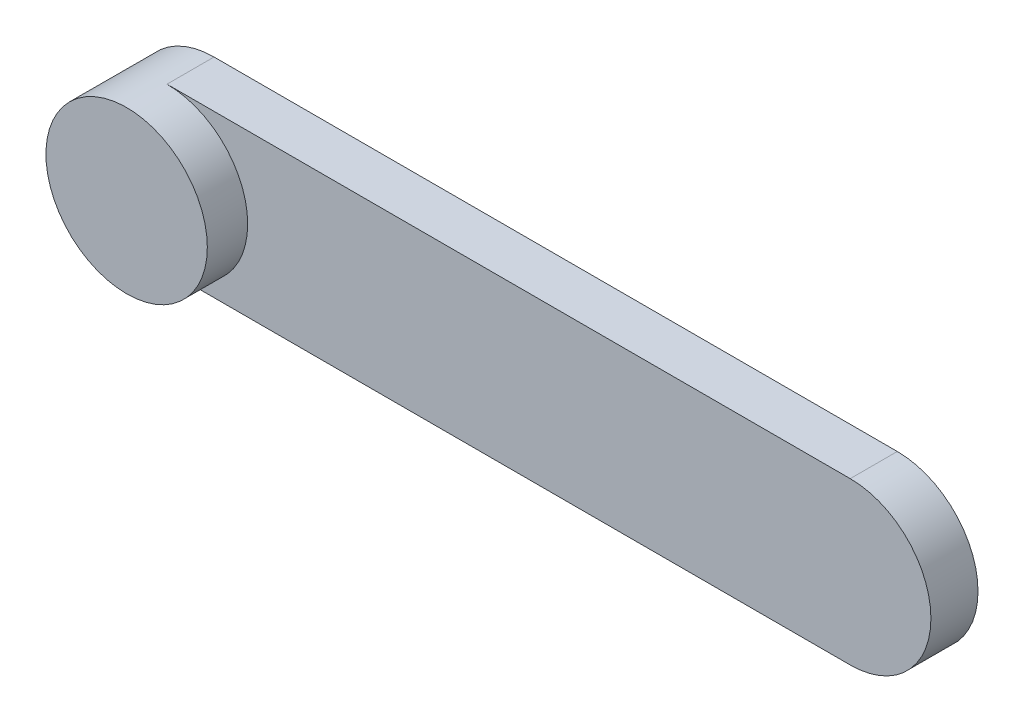
ISO-10303-21;
HEADER;
FILE_DESCRIPTION(('STEP AP214'),'2;1');
FILE_NAME('part.step','',(''),(''),'','','');
FILE_SCHEMA(('AUTOMOTIVE_DESIGN { 1 0 10303 214 1 1 1 1 }'));
ENDSEC;
DATA;
#1=APPLICATION_CONTEXT('core data for automotive mechanical design processes');
#2=APPLICATION_PROTOCOL_DEFINITION('international standard','automotive_design',2000,#1);
#3=PRODUCT_CONTEXT('',#1,'mechanical');
#4=PRODUCT('Part','Part','',(#3));
#5=PRODUCT_RELATED_PRODUCT_CATEGORY('part','',(#4));
#6=PRODUCT_DEFINITION_FORMATION('','',#4);
#7=PRODUCT_DEFINITION_CONTEXT('part definition',#1,'design');
#8=PRODUCT_DEFINITION('design','',#6,#7);
#9=PRODUCT_DEFINITION_SHAPE('','',#8);
#10=(LENGTH_UNIT() NAMED_UNIT(*) SI_UNIT(.MILLI.,.METRE.));
#11=(NAMED_UNIT(*) PLANE_ANGLE_UNIT() SI_UNIT($,.RADIAN.));
#12=(NAMED_UNIT(*) SI_UNIT($,.STERADIAN.) SOLID_ANGLE_UNIT());
#13=UNCERTAINTY_MEASURE_WITH_UNIT(LENGTH_MEASURE(1.E-05),#10,'distance_accuracy_value','');
#14=(GEOMETRIC_REPRESENTATION_CONTEXT(3) GLOBAL_UNCERTAINTY_ASSIGNED_CONTEXT((#13)) GLOBAL_UNIT_ASSIGNED_CONTEXT((#10,
#11,#12)) REPRESENTATION_CONTEXT('',''));
#15=CARTESIAN_POINT('',(0.,0.,0.));
#16=DIRECTION('',(0.,0.,1.));
#17=DIRECTION('',(1.,0.,0.));
#18=AXIS2_PLACEMENT_3D('',#15,#16,#17);
#19=CARTESIAN_POINT('',(50.8,0.,1.75));
#20=DIRECTION('',(0.,0.,-1.));
#21=DIRECTION('',(-1.,0.,0.));
#22=AXIS2_PLACEMENT_3D('',#19,#20,#21);
#23=CYLINDRICAL_SURFACE('',#22,6.);
#24=CARTESIAN_POINT('',(50.8,0.,-1.75));
#25=DIRECTION('',(0.,0.,1.));
#26=DIRECTION('',(1.,0.,0.));
#27=AXIS2_PLACEMENT_3D('',#24,#25,#26);
#28=CIRCLE('',#27,6.);
#29=CARTESIAN_POINT('',(50.8,-6.,-1.75));
#30=VERTEX_POINT('',#29);
#31=CARTESIAN_POINT('',(50.8,6.,-1.75));
#32=VERTEX_POINT('',#31);
#33=EDGE_CURVE('E103',#30,#32,#28,.T.);
#34=ORIENTED_EDGE('',*,*,#33,.T.);
#35=DIRECTION('',(0.,0.,-1.));
#36=VECTOR('',#35,1.);
#37=CARTESIAN_POINT('',(50.8,6.,1.75));
#38=LINE('',#37,#36);
#39=CARTESIAN_POINT('',(50.8,6.,1.75));
#40=VERTEX_POINT('',#39);
#41=EDGE_CURVE('E39',#40,#32,#38,.T.);
#42=ORIENTED_EDGE('',*,*,#41,.F.);
#43=CARTESIAN_POINT('',(50.8,0.,1.75));
#44=DIRECTION('',(0.,0.,1.));
#45=DIRECTION('',(1.,0.,0.));
#46=AXIS2_PLACEMENT_3D('',#43,#44,#45);
#47=CIRCLE('',#46,6.);
#48=CARTESIAN_POINT('',(50.8,-6.,1.75));
#49=VERTEX_POINT('',#48);
#50=EDGE_CURVE('E91',#49,#40,#47,.T.);
#51=ORIENTED_EDGE('',*,*,#50,.F.);
#52=DIRECTION('',(0.,0.,-1.));
#53=VECTOR('',#52,1.);
#54=CARTESIAN_POINT('',(50.8,-6.,1.75));
#55=LINE('',#54,#53);
#56=EDGE_CURVE('E96',#49,#30,#55,.T.);
#57=ORIENTED_EDGE('',*,*,#56,.T.);
#58=EDGE_LOOP('',(#34,#42,#51,#57));
#59=FACE_BOUND('',#58,.T.);
#60=ADVANCED_FACE('F36',(#59),#23,.T.);
#61=CARTESIAN_POINT('',(0.,6.,1.75));
#62=DIRECTION('',(0.,-1.,0.));
#63=DIRECTION('',(1.,0.,0.));
#64=AXIS2_PLACEMENT_3D('',#61,#62,#63);
#65=PLANE('',#64);
#66=DIRECTION('',(-1.,0.,0.));
#67=VECTOR('',#66,1.);
#68=CARTESIAN_POINT('',(0.,6.,-1.75));
#69=LINE('',#68,#67);
#70=CARTESIAN_POINT('',(0.,6.,-1.75));
#71=VERTEX_POINT('',#70);
#72=EDGE_CURVE('E87',#32,#71,#69,.T.);
#73=ORIENTED_EDGE('',*,*,#72,.T.);
#74=DIRECTION('',(0.,0.,-1.));
#75=VECTOR('',#74,1.);
#76=CARTESIAN_POINT('',(0.,6.,1.75));
#77=LINE('',#76,#75);
#78=CARTESIAN_POINT('',(0.,6.,1.75));
#79=VERTEX_POINT('',#78);
#80=EDGE_CURVE('E85',#79,#71,#77,.T.);
#81=ORIENTED_EDGE('',*,*,#80,.F.);
#82=DIRECTION('',(-1.,0.,0.));
#83=VECTOR('',#82,1.);
#84=CARTESIAN_POINT('',(0.,6.,1.75));
#85=LINE('',#84,#83);
#86=EDGE_CURVE('E83',#40,#79,#85,.T.);
#87=ORIENTED_EDGE('',*,*,#86,.F.);
#88=ORIENTED_EDGE('',*,*,#41,.T.);
#89=EDGE_LOOP('',(#73,#81,#87,#88));
#90=FACE_BOUND('',#89,.T.);
#91=ADVANCED_FACE('F86',(#90),#65,.F.);
#92=CARTESIAN_POINT('',(0.,0.,1.75));
#93=DIRECTION('',(0.,0.,-1.));
#94=DIRECTION('',(-1.,0.,0.));
#95=AXIS2_PLACEMENT_3D('',#92,#93,#94);
#96=CYLINDRICAL_SURFACE('',#95,6.);
#97=CARTESIAN_POINT('',(0.,0.,-1.75));
#98=DIRECTION('',(0.,0.,1.));
#99=DIRECTION('',(1.,0.,0.));
#100=AXIS2_PLACEMENT_3D('',#97,#98,#99);
#101=CIRCLE('',#100,6.);
#102=CARTESIAN_POINT('',(0.,-6.,-1.75));
#103=VERTEX_POINT('',#102);
#104=EDGE_CURVE('E71',#71,#103,#101,.T.);
#105=ORIENTED_EDGE('',*,*,#104,.T.);
#106=DIRECTION('',(0.,0.,-1.));
#107=VECTOR('',#106,1.);
#108=CARTESIAN_POINT('',(0.,-6.,1.75));
#109=LINE('',#108,#107);
#110=CARTESIAN_POINT('',(0.,-6.,1.75));
#111=VERTEX_POINT('',#110);
#112=EDGE_CURVE('E88',#111,#103,#109,.T.);
#113=ORIENTED_EDGE('',*,*,#112,.F.);
#114=CARTESIAN_POINT('',(0.,0.,1.75));
#115=DIRECTION('',(0.,0.,1.));
#116=DIRECTION('',(1.,0.,0.));
#117=AXIS2_PLACEMENT_3D('',#114,#115,#116);
#118=CIRCLE('',#117,6.);
#119=EDGE_CURVE('E11',#111,#79,#118,.T.);
#120=ORIENTED_EDGE('',*,*,#119,.T.);
#121=ORIENTED_EDGE('',*,*,#80,.T.);
#122=EDGE_LOOP('',(#105,#113,#120,#121));
#123=FACE_BOUND('',#122,.T.);
#124=CARTESIAN_POINT('',(0.,0.,4.75));
#125=DIRECTION('',(0.,0.,1.));
#126=DIRECTION('',(1.,0.,0.));
#127=AXIS2_PLACEMENT_3D('',#124,#125,#126);
#128=CIRCLE('',#127,6.);
#129=CARTESIAN_POINT('',(6.,0.,4.75));
#130=VERTEX_POINT('',#129);
#131=EDGE_CURVE('E106',#130,#130,#128,.T.);
#132=ORIENTED_EDGE('',*,*,#131,.F.);
#133=EDGE_LOOP('',(#132));
#134=FACE_BOUND('',#133,.T.);
#135=ADVANCED_FACE('F94',(#123,#134),#96,.T.);
#136=CARTESIAN_POINT('',(50.8,-6.,1.75));
#137=DIRECTION('',(0.,1.,0.));
#138=DIRECTION('',(-1.,0.,0.));
#139=AXIS2_PLACEMENT_3D('',#136,#137,#138);
#140=PLANE('',#139);
#141=DIRECTION('',(1.,0.,0.));
#142=VECTOR('',#141,1.);
#143=CARTESIAN_POINT('',(50.8,-6.,-1.75));
#144=LINE('',#143,#142);
#145=EDGE_CURVE('E76',#103,#30,#144,.T.);
#146=ORIENTED_EDGE('',*,*,#145,.T.);
#147=ORIENTED_EDGE('',*,*,#56,.F.);
#148=DIRECTION('',(1.,0.,0.));
#149=VECTOR('',#148,1.);
#150=CARTESIAN_POINT('',(50.8,-6.,1.75));
#151=LINE('',#150,#149);
#152=EDGE_CURVE('E53',#111,#49,#151,.T.);
#153=ORIENTED_EDGE('',*,*,#152,.F.);
#154=ORIENTED_EDGE('',*,*,#112,.T.);
#155=EDGE_LOOP('',(#146,#147,#153,#154));
#156=FACE_BOUND('',#155,.T.);
#157=ADVANCED_FACE('F98',(#156),#140,.F.);
#158=CARTESIAN_POINT('',(50.8,0.,1.75));
#159=DIRECTION('',(0.,0.,1.));
#160=DIRECTION('',(1.,0.,0.));
#161=AXIS2_PLACEMENT_3D('',#158,#159,#160);
#162=PLANE('',#161);
#163=ORIENTED_EDGE('',*,*,#119,.F.);
#164=ORIENTED_EDGE('',*,*,#152,.T.);
#165=ORIENTED_EDGE('',*,*,#50,.T.);
#166=ORIENTED_EDGE('',*,*,#86,.T.);
#167=EDGE_LOOP('',(#163,#164,#165,#166));
#168=FACE_BOUND('',#167,.T.);
#169=ADVANCED_FACE('F89',(#168),#162,.T.);
#170=CARTESIAN_POINT('',(50.8,0.,-1.75));
#171=DIRECTION('',(0.,0.,1.));
#172=DIRECTION('',(1.,0.,0.));
#173=AXIS2_PLACEMENT_3D('',#170,#171,#172);
#174=PLANE('',#173);
#175=ORIENTED_EDGE('',*,*,#33,.F.);
#176=ORIENTED_EDGE('',*,*,#145,.F.);
#177=ORIENTED_EDGE('',*,*,#104,.F.);
#178=ORIENTED_EDGE('',*,*,#72,.F.);
#179=EDGE_LOOP('',(#175,#176,#177,#178));
#180=FACE_BOUND('',#179,.T.);
#181=ADVANCED_FACE('F127',(#180),#174,.F.);
#182=CARTESIAN_POINT('',(0.,0.,4.75));
#183=DIRECTION('',(0.,0.,1.));
#184=DIRECTION('',(1.,0.,0.));
#185=AXIS2_PLACEMENT_3D('',#182,#183,#184);
#186=PLANE('',#185);
#187=ORIENTED_EDGE('',*,*,#131,.T.);
#188=EDGE_LOOP('',(#187));
#189=FACE_BOUND('',#188,.T.);
#190=ADVANCED_FACE('F113',(#189),#186,.T.);
#191=CLOSED_SHELL('',(#60,#91,#135,#157,#169,#181,#190));
#192=MANIFOLD_SOLID_BREP('B2',#191);
#193=ADVANCED_BREP_SHAPE_REPRESENTATION('',(#18,#192),#14);
#194=SHAPE_DEFINITION_REPRESENTATION(#9,#193);
ENDSEC;
END-ISO-10303-21;
